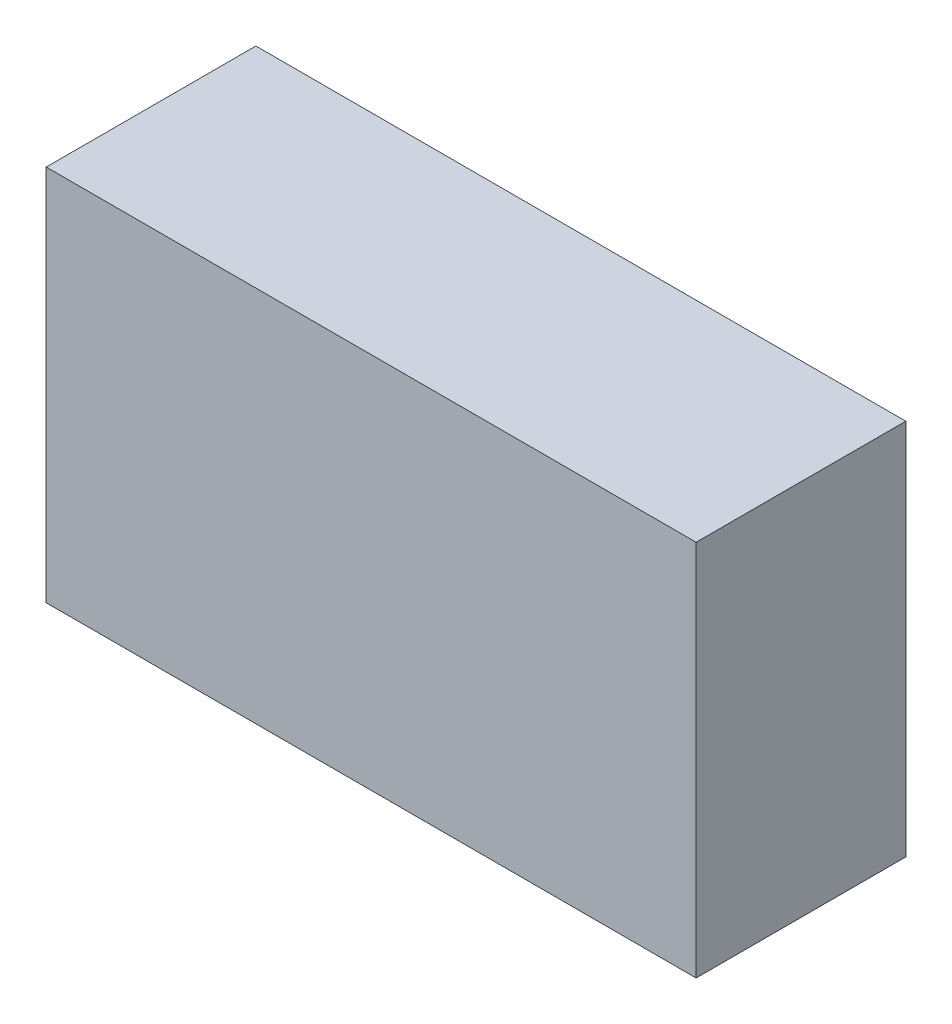
ISO-10303-21;
HEADER;
FILE_DESCRIPTION(('STEP AP214'),'2;1');
FILE_NAME('part.step','',(''),(''),'','','');
FILE_SCHEMA(('AUTOMOTIVE_DESIGN { 1 0 10303 214 1 1 1 1 }'));
ENDSEC;
DATA;
#1=APPLICATION_CONTEXT('core data for automotive mechanical design processes');
#2=APPLICATION_PROTOCOL_DEFINITION('international standard','automotive_design',2000,#1);
#3=PRODUCT_CONTEXT('',#1,'mechanical');
#4=PRODUCT('Part','Part','',(#3));
#5=PRODUCT_RELATED_PRODUCT_CATEGORY('part','',(#4));
#6=PRODUCT_DEFINITION_FORMATION('','',#4);
#7=PRODUCT_DEFINITION_CONTEXT('part definition',#1,'design');
#8=PRODUCT_DEFINITION('design','',#6,#7);
#9=PRODUCT_DEFINITION_SHAPE('','',#8);
#10=(LENGTH_UNIT() NAMED_UNIT(*) SI_UNIT(.MILLI.,.METRE.));
#11=(NAMED_UNIT(*) PLANE_ANGLE_UNIT() SI_UNIT($,.RADIAN.));
#12=(NAMED_UNIT(*) SI_UNIT($,.STERADIAN.) SOLID_ANGLE_UNIT());
#13=UNCERTAINTY_MEASURE_WITH_UNIT(LENGTH_MEASURE(1.E-05),#10,'distance_accuracy_value','');
#14=(GEOMETRIC_REPRESENTATION_CONTEXT(3) GLOBAL_UNCERTAINTY_ASSIGNED_CONTEXT((#13)) GLOBAL_UNIT_ASSIGNED_CONTEXT((#10,
#11,#12)) REPRESENTATION_CONTEXT('',''));
#15=CARTESIAN_POINT('',(0.,0.,0.));
#16=DIRECTION('',(0.,0.,1.));
#17=DIRECTION('',(1.,0.,0.));
#18=AXIS2_PLACEMENT_3D('',#15,#16,#17);
#19=CARTESIAN_POINT('',(1.54999944,0.90000074,1.));
#20=DIRECTION('',(0.,0.,1.));
#21=DIRECTION('',(1.,0.,0.));
#22=AXIS2_PLACEMENT_3D('',#19,#20,#21);
#23=PLANE('',#22);
#24=DIRECTION('',(0.,1.,0.));
#25=VECTOR('',#24,1.);
#26=CARTESIAN_POINT('',(-1.54999944,-0.90000074,1.));
#27=LINE('',#26,#25);
#28=CARTESIAN_POINT('',(-1.54999944,-0.90000074,1.));
#29=VERTEX_POINT('',#28);
#30=CARTESIAN_POINT('',(-1.54999944,0.90000074,1.));
#31=VERTEX_POINT('',#30);
#32=EDGE_CURVE('E58',#29,#31,#27,.T.);
#33=ORIENTED_EDGE('',*,*,#32,.F.);
#34=DIRECTION('',(1.,0.,0.));
#35=VECTOR('',#34,1.);
#36=CARTESIAN_POINT('',(1.54999944,-0.90000074,1.));
#37=LINE('',#36,#35);
#38=CARTESIAN_POINT('',(1.54999944,-0.90000074,1.));
#39=VERTEX_POINT('',#38);
#40=EDGE_CURVE('E53',#39,#29,#37,.F.);
#41=ORIENTED_EDGE('',*,*,#40,.F.);
#42=DIRECTION('',(0.,1.,0.));
#43=VECTOR('',#42,1.);
#44=CARTESIAN_POINT('',(1.54999944,0.90000074,1.));
#45=LINE('',#44,#43);
#46=CARTESIAN_POINT('',(1.54999944,0.90000074,1.));
#47=VERTEX_POINT('',#46);
#48=EDGE_CURVE('E68',#47,#39,#45,.F.);
#49=ORIENTED_EDGE('',*,*,#48,.F.);
#50=DIRECTION('',(1.,0.,0.));
#51=VECTOR('',#50,1.);
#52=CARTESIAN_POINT('',(-1.54999944,0.90000074,1.));
#53=LINE('',#52,#51);
#54=EDGE_CURVE('E20',#31,#47,#53,.T.);
#55=ORIENTED_EDGE('',*,*,#54,.F.);
#56=EDGE_LOOP('',(#33,#41,#49,#55));
#57=FACE_BOUND('',#56,.T.);
#58=ADVANCED_FACE('F17',(#57),#23,.T.);
#59=CARTESIAN_POINT('',(-1.54999944,0.90000074,0.));
#60=DIRECTION('',(0.,1.,0.));
#61=DIRECTION('',(0.,0.,1.));
#62=AXIS2_PLACEMENT_3D('',#59,#60,#61);
#63=PLANE('',#62);
#64=DIRECTION('',(0.,0.,-1.));
#65=VECTOR('',#64,1.);
#66=CARTESIAN_POINT('',(1.54999944,0.90000074,0.));
#67=LINE('',#66,#65);
#68=CARTESIAN_POINT('',(1.54999944,0.90000074,0.));
#69=VERTEX_POINT('',#68);
#70=EDGE_CURVE('E79',#69,#47,#67,.F.);
#71=ORIENTED_EDGE('',*,*,#70,.F.);
#72=DIRECTION('',(1.,0.,0.));
#73=VECTOR('',#72,1.);
#74=CARTESIAN_POINT('',(1.54999944,0.90000074,0.));
#75=LINE('',#74,#73);
#76=CARTESIAN_POINT('',(-1.54999944,0.90000074,0.));
#77=VERTEX_POINT('',#76);
#78=EDGE_CURVE('E74',#69,#77,#75,.F.);
#79=ORIENTED_EDGE('',*,*,#78,.T.);
#80=DIRECTION('',(0.,0.,1.));
#81=VECTOR('',#80,1.);
#82=CARTESIAN_POINT('',(-1.54999944,0.90000074,0.));
#83=LINE('',#82,#81);
#84=EDGE_CURVE('E63',#31,#77,#83,.F.);
#85=ORIENTED_EDGE('',*,*,#84,.F.);
#86=ORIENTED_EDGE('',*,*,#54,.T.);
#87=EDGE_LOOP('',(#71,#79,#85,#86));
#88=FACE_BOUND('',#87,.T.);
#89=ADVANCED_FACE('F73',(#88),#63,.T.);
#90=CARTESIAN_POINT('',(-1.54999944,-0.90000074,0.));
#91=DIRECTION('',(-1.,0.,0.));
#92=DIRECTION('',(0.,0.,1.));
#93=AXIS2_PLACEMENT_3D('',#90,#91,#92);
#94=PLANE('',#93);
#95=ORIENTED_EDGE('',*,*,#84,.T.);
#96=DIRECTION('',(0.,1.,0.));
#97=VECTOR('',#96,1.);
#98=CARTESIAN_POINT('',(-1.54999944,0.90000074,0.));
#99=LINE('',#98,#97);
#100=CARTESIAN_POINT('',(-1.54999944,-0.90000074,0.));
#101=VERTEX_POINT('',#100);
#102=EDGE_CURVE('E84',#77,#101,#99,.F.);
#103=ORIENTED_EDGE('',*,*,#102,.T.);
#104=DIRECTION('',(0.,0.,-1.));
#105=VECTOR('',#104,1.);
#106=CARTESIAN_POINT('',(-1.54999944,-0.90000074,0.));
#107=LINE('',#106,#105);
#108=EDGE_CURVE('E65',#29,#101,#107,.T.);
#109=ORIENTED_EDGE('',*,*,#108,.F.);
#110=ORIENTED_EDGE('',*,*,#32,.T.);
#111=EDGE_LOOP('',(#95,#103,#109,#110));
#112=FACE_BOUND('',#111,.T.);
#113=ADVANCED_FACE('F60',(#112),#94,.T.);
#114=CARTESIAN_POINT('',(1.54999944,-0.90000074,0.));
#115=DIRECTION('',(0.,-1.,0.));
#116=DIRECTION('',(0.,0.,-1.));
#117=AXIS2_PLACEMENT_3D('',#114,#115,#116);
#118=PLANE('',#117);
#119=ORIENTED_EDGE('',*,*,#108,.T.);
#120=DIRECTION('',(1.,0.,0.));
#121=VECTOR('',#120,1.);
#122=CARTESIAN_POINT('',(1.54999944,-0.90000074,0.));
#123=LINE('',#122,#121);
#124=CARTESIAN_POINT('',(1.54999944,-0.90000074,0.));
#125=VERTEX_POINT('',#124);
#126=EDGE_CURVE('E26',#101,#125,#123,.T.);
#127=ORIENTED_EDGE('',*,*,#126,.T.);
#128=DIRECTION('',(0.,0.,-1.));
#129=VECTOR('',#128,1.);
#130=CARTESIAN_POINT('',(1.54999944,-0.90000074,0.));
#131=LINE('',#130,#129);
#132=EDGE_CURVE('E34',#39,#125,#131,.T.);
#133=ORIENTED_EDGE('',*,*,#132,.F.);
#134=ORIENTED_EDGE('',*,*,#40,.T.);
#135=EDGE_LOOP('',(#119,#127,#133,#134));
#136=FACE_BOUND('',#135,.T.);
#137=ADVANCED_FACE('F88',(#136),#118,.T.);
#138=CARTESIAN_POINT('',(1.54999944,0.90000074,0.));
#139=DIRECTION('',(1.,0.,0.));
#140=DIRECTION('',(0.,0.,-1.));
#141=AXIS2_PLACEMENT_3D('',#138,#139,#140);
#142=PLANE('',#141);
#143=ORIENTED_EDGE('',*,*,#132,.T.);
#144=DIRECTION('',(0.,1.,0.));
#145=VECTOR('',#144,1.);
#146=CARTESIAN_POINT('',(1.54999944,0.90000074,0.));
#147=LINE('',#146,#145);
#148=EDGE_CURVE('E11',#125,#69,#147,.T.);
#149=ORIENTED_EDGE('',*,*,#148,.T.);
#150=ORIENTED_EDGE('',*,*,#70,.T.);
#151=ORIENTED_EDGE('',*,*,#48,.T.);
#152=EDGE_LOOP('',(#143,#149,#150,#151));
#153=FACE_BOUND('',#152,.T.);
#154=ADVANCED_FACE('F91',(#153),#142,.T.);
#155=CARTESIAN_POINT('',(1.54999944,0.90000074,0.));
#156=DIRECTION('',(0.,0.,1.));
#157=DIRECTION('',(1.,0.,0.));
#158=AXIS2_PLACEMENT_3D('',#155,#156,#157);
#159=PLANE('',#158);
#160=ORIENTED_EDGE('',*,*,#126,.F.);
#161=ORIENTED_EDGE('',*,*,#102,.F.);
#162=ORIENTED_EDGE('',*,*,#78,.F.);
#163=ORIENTED_EDGE('',*,*,#148,.F.);
#164=EDGE_LOOP('',(#160,#161,#162,#163));
#165=FACE_BOUND('',#164,.T.);
#166=ADVANCED_FACE('F90',(#165),#159,.F.);
#167=CLOSED_SHELL('',(#58,#89,#113,#137,#154,#166));
#168=MANIFOLD_SOLID_BREP('B1',#167);
#169=ADVANCED_BREP_SHAPE_REPRESENTATION('',(#18,#168),#14);
#170=SHAPE_DEFINITION_REPRESENTATION(#9,#169);
ENDSEC;
END-ISO-10303-21;
